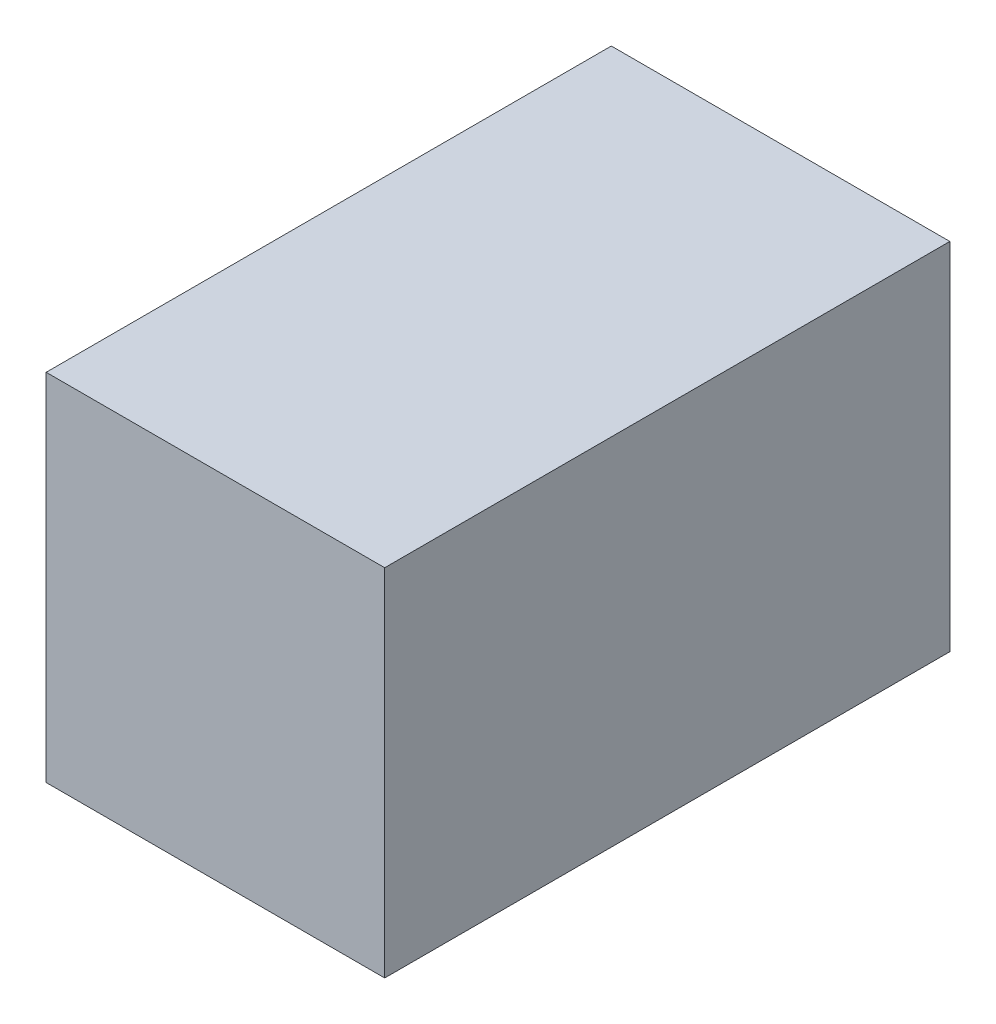
ISO-10303-21;
HEADER;
FILE_DESCRIPTION(('STEP AP214'),'2;1');
FILE_NAME('part.step','',(''),(''),'','','');
FILE_SCHEMA(('AUTOMOTIVE_DESIGN { 1 0 10303 214 1 1 1 1 }'));
ENDSEC;
DATA;
#1=APPLICATION_CONTEXT('core data for automotive mechanical design processes');
#2=APPLICATION_PROTOCOL_DEFINITION('international standard','automotive_design',2000,#1);
#3=PRODUCT_CONTEXT('',#1,'mechanical');
#4=PRODUCT('Part','Part','',(#3));
#5=PRODUCT_RELATED_PRODUCT_CATEGORY('part','',(#4));
#6=PRODUCT_DEFINITION_FORMATION('','',#4);
#7=PRODUCT_DEFINITION_CONTEXT('part definition',#1,'design');
#8=PRODUCT_DEFINITION('design','',#6,#7);
#9=PRODUCT_DEFINITION_SHAPE('','',#8);
#10=(LENGTH_UNIT() NAMED_UNIT(*) SI_UNIT(.MILLI.,.METRE.));
#11=(NAMED_UNIT(*) PLANE_ANGLE_UNIT() SI_UNIT($,.RADIAN.));
#12=(NAMED_UNIT(*) SI_UNIT($,.STERADIAN.) SOLID_ANGLE_UNIT());
#13=UNCERTAINTY_MEASURE_WITH_UNIT(LENGTH_MEASURE(1.E-05),#10,'distance_accuracy_value','');
#14=(GEOMETRIC_REPRESENTATION_CONTEXT(3) GLOBAL_UNCERTAINTY_ASSIGNED_CONTEXT((#13)) GLOBAL_UNIT_ASSIGNED_CONTEXT((#10,
#11,#12)) REPRESENTATION_CONTEXT('',''));
#15=CARTESIAN_POINT('',(0.,0.,0.));
#16=DIRECTION('',(0.,0.,1.));
#17=DIRECTION('',(1.,0.,0.));
#18=AXIS2_PLACEMENT_3D('',#15,#16,#17);
#19=CARTESIAN_POINT('',(-60.5,127.,101.));
#20=DIRECTION('',(1.,0.,0.));
#21=DIRECTION('',(0.,0.,-1.));
#22=AXIS2_PLACEMENT_3D('',#19,#20,#21);
#23=PLANE('',#22);
#24=DIRECTION('',(0.,0.,1.));
#25=VECTOR('',#24,1.);
#26=CARTESIAN_POINT('',(-60.5,0.,101.));
#27=LINE('',#26,#25);
#28=CARTESIAN_POINT('',(-60.5,0.,-101.));
#29=VERTEX_POINT('',#28);
#30=CARTESIAN_POINT('',(-60.5,0.,101.));
#31=VERTEX_POINT('',#30);
#32=EDGE_CURVE('E96',#29,#31,#27,.T.);
#33=ORIENTED_EDGE('',*,*,#32,.T.);
#34=DIRECTION('',(0.,-1.,0.));
#35=VECTOR('',#34,1.);
#36=CARTESIAN_POINT('',(-60.5,127.,101.));
#37=LINE('',#36,#35);
#38=CARTESIAN_POINT('',(-60.5,127.,101.));
#39=VERTEX_POINT('',#38);
#40=EDGE_CURVE('E11',#39,#31,#37,.T.);
#41=ORIENTED_EDGE('',*,*,#40,.F.);
#42=DIRECTION('',(0.,0.,1.));
#43=VECTOR('',#42,1.);
#44=CARTESIAN_POINT('',(-60.5,127.,101.));
#45=LINE('',#44,#43);
#46=CARTESIAN_POINT('',(-60.5,127.,-101.));
#47=VERTEX_POINT('',#46);
#48=EDGE_CURVE('E84',#47,#39,#45,.T.);
#49=ORIENTED_EDGE('',*,*,#48,.F.);
#50=DIRECTION('',(0.,-1.,0.));
#51=VECTOR('',#50,1.);
#52=CARTESIAN_POINT('',(-60.5,127.,-101.));
#53=LINE('',#52,#51);
#54=EDGE_CURVE('E92',#47,#29,#53,.T.);
#55=ORIENTED_EDGE('',*,*,#54,.T.);
#56=EDGE_LOOP('',(#33,#41,#49,#55));
#57=FACE_BOUND('',#56,.T.);
#58=ADVANCED_FACE('F33',(#57),#23,.F.);
#59=CARTESIAN_POINT('',(60.5,127.,101.));
#60=DIRECTION('',(0.,0.,-1.));
#61=DIRECTION('',(-1.,0.,0.));
#62=AXIS2_PLACEMENT_3D('',#59,#60,#61);
#63=PLANE('',#62);
#64=DIRECTION('',(1.,0.,0.));
#65=VECTOR('',#64,1.);
#66=CARTESIAN_POINT('',(60.5,0.,101.));
#67=LINE('',#66,#65);
#68=CARTESIAN_POINT('',(60.5,0.,101.));
#69=VERTEX_POINT('',#68);
#70=EDGE_CURVE('E88',#31,#69,#67,.T.);
#71=ORIENTED_EDGE('',*,*,#70,.T.);
#72=DIRECTION('',(0.,-1.,0.));
#73=VECTOR('',#72,1.);
#74=CARTESIAN_POINT('',(60.5,127.,101.));
#75=LINE('',#74,#73);
#76=CARTESIAN_POINT('',(60.5,127.,101.));
#77=VERTEX_POINT('',#76);
#78=EDGE_CURVE('E41',#77,#69,#75,.T.);
#79=ORIENTED_EDGE('',*,*,#78,.F.);
#80=DIRECTION('',(1.,0.,0.));
#81=VECTOR('',#80,1.);
#82=CARTESIAN_POINT('',(60.5,127.,101.));
#83=LINE('',#82,#81);
#84=EDGE_CURVE('E79',#39,#77,#83,.T.);
#85=ORIENTED_EDGE('',*,*,#84,.F.);
#86=ORIENTED_EDGE('',*,*,#40,.T.);
#87=EDGE_LOOP('',(#71,#79,#85,#86));
#88=FACE_BOUND('',#87,.T.);
#89=ADVANCED_FACE('F87',(#88),#63,.F.);
#90=CARTESIAN_POINT('',(60.5,127.,101.));
#91=DIRECTION('',(-1.,0.,0.));
#92=DIRECTION('',(0.,0.,1.));
#93=AXIS2_PLACEMENT_3D('',#90,#91,#92);
#94=PLANE('',#93);
#95=DIRECTION('',(0.,0.,-1.));
#96=VECTOR('',#95,1.);
#97=CARTESIAN_POINT('',(60.5,0.,101.));
#98=LINE('',#97,#96);
#99=CARTESIAN_POINT('',(60.5,0.,-101.));
#100=VERTEX_POINT('',#99);
#101=EDGE_CURVE('E66',#69,#100,#98,.T.);
#102=ORIENTED_EDGE('',*,*,#101,.T.);
#103=DIRECTION('',(0.,-1.,0.));
#104=VECTOR('',#103,1.);
#105=CARTESIAN_POINT('',(60.5,127.,-101.));
#106=LINE('',#105,#104);
#107=CARTESIAN_POINT('',(60.5,127.,-101.));
#108=VERTEX_POINT('',#107);
#109=EDGE_CURVE('E89',#108,#100,#106,.T.);
#110=ORIENTED_EDGE('',*,*,#109,.F.);
#111=DIRECTION('',(0.,0.,-1.));
#112=VECTOR('',#111,1.);
#113=CARTESIAN_POINT('',(60.5,127.,101.));
#114=LINE('',#113,#112);
#115=EDGE_CURVE('E82',#77,#108,#114,.T.);
#116=ORIENTED_EDGE('',*,*,#115,.F.);
#117=ORIENTED_EDGE('',*,*,#78,.T.);
#118=EDGE_LOOP('',(#102,#110,#116,#117));
#119=FACE_BOUND('',#118,.T.);
#120=ADVANCED_FACE('F90',(#119),#94,.F.);
#121=CARTESIAN_POINT('',(60.5,127.,-101.));
#122=DIRECTION('',(0.,0.,1.));
#123=DIRECTION('',(1.,0.,0.));
#124=AXIS2_PLACEMENT_3D('',#121,#122,#123);
#125=PLANE('',#124);
#126=DIRECTION('',(-1.,0.,0.));
#127=VECTOR('',#126,1.);
#128=CARTESIAN_POINT('',(60.5,0.,-101.));
#129=LINE('',#128,#127);
#130=EDGE_CURVE('E72',#100,#29,#129,.T.);
#131=ORIENTED_EDGE('',*,*,#130,.T.);
#132=ORIENTED_EDGE('',*,*,#54,.F.);
#133=DIRECTION('',(-1.,0.,0.));
#134=VECTOR('',#133,1.);
#135=CARTESIAN_POINT('',(60.5,127.,-101.));
#136=LINE('',#135,#134);
#137=EDGE_CURVE('E49',#108,#47,#136,.T.);
#138=ORIENTED_EDGE('',*,*,#137,.F.);
#139=ORIENTED_EDGE('',*,*,#109,.T.);
#140=EDGE_LOOP('',(#131,#132,#138,#139));
#141=FACE_BOUND('',#140,.T.);
#142=ADVANCED_FACE('F103',(#141),#125,.F.);
#143=CARTESIAN_POINT('',(0.,127.,0.));
#144=DIRECTION('',(0.,1.,0.));
#145=DIRECTION('',(0.,0.,1.));
#146=AXIS2_PLACEMENT_3D('',#143,#144,#145);
#147=PLANE('',#146);
#148=ORIENTED_EDGE('',*,*,#48,.T.);
#149=ORIENTED_EDGE('',*,*,#84,.T.);
#150=ORIENTED_EDGE('',*,*,#115,.T.);
#151=ORIENTED_EDGE('',*,*,#137,.T.);
#152=EDGE_LOOP('',(#148,#149,#150,#151));
#153=FACE_BOUND('',#152,.T.);
#154=ADVANCED_FACE('F80',(#153),#147,.T.);
#155=CARTESIAN_POINT('',(0.,0.,0.));
#156=DIRECTION('',(0.,1.,0.));
#157=DIRECTION('',(0.,0.,1.));
#158=AXIS2_PLACEMENT_3D('',#155,#156,#157);
#159=PLANE('',#158);
#160=ORIENTED_EDGE('',*,*,#32,.F.);
#161=ORIENTED_EDGE('',*,*,#130,.F.);
#162=ORIENTED_EDGE('',*,*,#101,.F.);
#163=ORIENTED_EDGE('',*,*,#70,.F.);
#164=EDGE_LOOP('',(#160,#161,#162,#163));
#165=FACE_BOUND('',#164,.T.);
#166=ADVANCED_FACE('F106',(#165),#159,.F.);
#167=CLOSED_SHELL('',(#58,#89,#120,#142,#154,#166));
#168=MANIFOLD_SOLID_BREP('B2',#167);
#169=ADVANCED_BREP_SHAPE_REPRESENTATION('',(#18,#168),#14);
#170=SHAPE_DEFINITION_REPRESENTATION(#9,#169);
ENDSEC;
END-ISO-10303-21;
